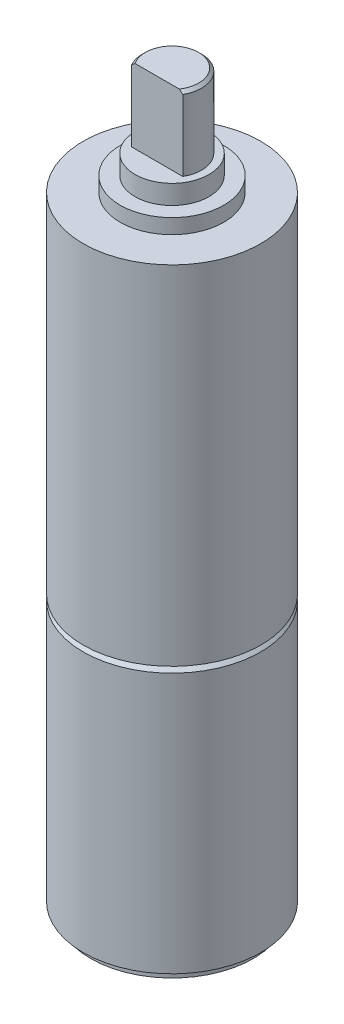
ISO-10303-21;
HEADER;
FILE_DESCRIPTION(('STEP AP214'),'2;1');
FILE_NAME('part.step','',(''),(''),'','','');
FILE_SCHEMA(('AUTOMOTIVE_DESIGN { 1 0 10303 214 1 1 1 1 }'));
ENDSEC;
DATA;
#1=APPLICATION_CONTEXT('core data for automotive mechanical design processes');
#2=APPLICATION_PROTOCOL_DEFINITION('international standard','automotive_design',2000,#1);
#3=PRODUCT_CONTEXT('',#1,'mechanical');
#4=PRODUCT('Part','Part','',(#3));
#5=PRODUCT_RELATED_PRODUCT_CATEGORY('part','',(#4));
#6=PRODUCT_DEFINITION_FORMATION('','',#4);
#7=PRODUCT_DEFINITION_CONTEXT('part definition',#1,'design');
#8=PRODUCT_DEFINITION('design','',#6,#7);
#9=PRODUCT_DEFINITION_SHAPE('','',#8);
#10=(LENGTH_UNIT() NAMED_UNIT(*) SI_UNIT(.MILLI.,.METRE.));
#11=(NAMED_UNIT(*) PLANE_ANGLE_UNIT() SI_UNIT($,.RADIAN.));
#12=(NAMED_UNIT(*) SI_UNIT($,.STERADIAN.) SOLID_ANGLE_UNIT());
#13=UNCERTAINTY_MEASURE_WITH_UNIT(LENGTH_MEASURE(1.E-05),#10,'distance_accuracy_value','');
#14=(GEOMETRIC_REPRESENTATION_CONTEXT(3) GLOBAL_UNCERTAINTY_ASSIGNED_CONTEXT((#13)) GLOBAL_UNIT_ASSIGNED_CONTEXT((#10,
#11,#12)) REPRESENTATION_CONTEXT('',''));
#15=CARTESIAN_POINT('',(0.,0.,0.));
#16=DIRECTION('',(0.,0.,1.));
#17=DIRECTION('',(1.,0.,0.));
#18=AXIS2_PLACEMENT_3D('',#15,#16,#17);
#19=CARTESIAN_POINT('',(0.,24.7,0.));
#20=DIRECTION('',(0.,-1.,0.));
#21=DIRECTION('',(0.,0.,-1.));
#22=AXIS2_PLACEMENT_3D('',#19,#20,#21);
#23=CYLINDRICAL_SURFACE('',#22,1.);
#24=DIRECTION('',(0.,1.,0.));
#25=VECTOR('',#24,1.);
#26=CARTESIAN_POINT('',(-0.866025403784439,22.2,0.5));
#27=LINE('',#26,#25);
#28=CARTESIAN_POINT('',(-0.866025403784439,22.2,0.5));
#29=VERTEX_POINT('',#28);
#30=CARTESIAN_POINT('',(-0.866025403784439,24.6,0.5));
#31=VERTEX_POINT('',#30);
#32=EDGE_CURVE('E84',#29,#31,#27,.T.);
#33=ORIENTED_EDGE('',*,*,#32,.T.);
#34=CARTESIAN_POINT('',(0.,24.6,0.));
#35=DIRECTION('',(0.,1.,0.));
#36=DIRECTION('',(0.,0.,1.));
#37=AXIS2_PLACEMENT_3D('',#34,#35,#36);
#38=CIRCLE('',#37,1.);
#39=CARTESIAN_POINT('',(0.866025403784438,24.6,0.5));
#40=VERTEX_POINT('',#39);
#41=EDGE_CURVE('E11',#31,#40,#38,.F.);
#42=ORIENTED_EDGE('',*,*,#41,.T.);
#43=DIRECTION('',(0.,1.,0.));
#44=VECTOR('',#43,1.);
#45=CARTESIAN_POINT('',(0.866025403784438,22.2,0.5));
#46=LINE('',#45,#44);
#47=CARTESIAN_POINT('',(0.866025403784438,22.2,0.5));
#48=VERTEX_POINT('',#47);
#49=EDGE_CURVE('E82',#48,#40,#46,.T.);
#50=ORIENTED_EDGE('',*,*,#49,.F.);
#51=CARTESIAN_POINT('',(0.,22.2,0.));
#52=DIRECTION('',(0.,1.,0.));
#53=DIRECTION('',(0.,0.,1.));
#54=AXIS2_PLACEMENT_3D('',#51,#52,#53);
#55=CIRCLE('',#54,1.);
#56=EDGE_CURVE('E90',#29,#48,#55,.F.);
#57=ORIENTED_EDGE('',*,*,#56,.F.);
#58=EDGE_LOOP('',(#33,#42,#50,#57));
#59=FACE_BOUND('',#58,.T.);
#60=ADVANCED_FACE('F47',(#59),#23,.T.);
#61=CARTESIAN_POINT('',(0.,24.7,0.));
#62=DIRECTION('',(0.,1.,0.));
#63=DIRECTION('',(0.,0.,1.));
#64=AXIS2_PLACEMENT_3D('',#61,#62,#63);
#65=PLANE('',#64);
#66=DIRECTION('',(1.,0.,0.));
#67=VECTOR('',#66,1.);
#68=CARTESIAN_POINT('',(0.,24.7,0.5));
#69=LINE('',#68,#67);
#70=CARTESIAN_POINT('',(-0.74833147735479,24.7,0.5));
#71=VERTEX_POINT('',#70);
#72=CARTESIAN_POINT('',(0.74833147735479,24.7,0.5));
#73=VERTEX_POINT('',#72);
#74=EDGE_CURVE('E88',#71,#73,#69,.T.);
#75=ORIENTED_EDGE('',*,*,#74,.T.);
#76=CARTESIAN_POINT('',(0.,24.7,0.));
#77=DIRECTION('',(0.,1.,0.));
#78=DIRECTION('',(0.,0.,1.));
#79=AXIS2_PLACEMENT_3D('',#76,#77,#78);
#80=CIRCLE('',#79,0.900000000000001);
#81=EDGE_CURVE('E103',#73,#71,#80,.T.);
#82=ORIENTED_EDGE('',*,*,#81,.T.);
#83=EDGE_LOOP('',(#75,#82));
#84=FACE_BOUND('',#83,.T.);
#85=ADVANCED_FACE('F120',(#84),#65,.T.);
#86=CARTESIAN_POINT('',(0.,0.3,0.));
#87=DIRECTION('',(0.,-1.,0.));
#88=DIRECTION('',(0.,0.,-1.));
#89=AXIS2_PLACEMENT_3D('',#86,#87,#88);
#90=CYLINDRICAL_SURFACE('',#89,2.75);
#91=CARTESIAN_POINT('',(0.,0.3,0.));
#92=DIRECTION('',(0.,1.,0.));
#93=DIRECTION('',(0.,0.,1.));
#94=AXIS2_PLACEMENT_3D('',#91,#92,#93);
#95=CIRCLE('',#94,2.75);
#96=CARTESIAN_POINT('',(0.,0.3,2.75));
#97=VERTEX_POINT('',#96);
#98=EDGE_CURVE('E184',#97,#97,#95,.T.);
#99=ORIENTED_EDGE('',*,*,#98,.F.);
#100=EDGE_LOOP('',(#99));
#101=FACE_BOUND('',#100,.T.);
#102=CARTESIAN_POINT('',(0.,0.,0.));
#103=DIRECTION('',(0.,1.,0.));
#104=DIRECTION('',(0.,0.,1.));
#105=AXIS2_PLACEMENT_3D('',#102,#103,#104);
#106=CIRCLE('',#105,2.75);
#107=CARTESIAN_POINT('',(0.,0.,2.75));
#108=VERTEX_POINT('',#107);
#109=EDGE_CURVE('E187',#108,#108,#106,.T.);
#110=ORIENTED_EDGE('',*,*,#109,.T.);
#111=EDGE_LOOP('',(#110));
#112=FACE_BOUND('',#111,.T.);
#113=ADVANCED_FACE('F124',(#101,#112),#90,.T.);
#114=CARTESIAN_POINT('',(0.,0.,0.));
#115=DIRECTION('',(0.,1.,0.));
#116=DIRECTION('',(0.,0.,1.));
#117=AXIS2_PLACEMENT_3D('',#114,#115,#116);
#118=PLANE('',#117);
#119=ORIENTED_EDGE('',*,*,#109,.F.);
#120=EDGE_LOOP('',(#119));
#121=FACE_BOUND('',#120,.T.);
#122=ADVANCED_FACE('F162',(#121),#118,.F.);
#123=CARTESIAN_POINT('',(0.,9.3,0.));
#124=DIRECTION('',(0.,-1.,0.));
#125=DIRECTION('',(0.,0.,-1.));
#126=AXIS2_PLACEMENT_3D('',#123,#124,#125);
#127=CYLINDRICAL_SURFACE('',#126,3.);
#128=CARTESIAN_POINT('',(0.,9.1,0.));
#129=DIRECTION('',(0.,1.,0.));
#130=DIRECTION('',(0.,0.,1.));
#131=AXIS2_PLACEMENT_3D('',#128,#129,#130);
#132=CIRCLE('',#131,3.);
#133=CARTESIAN_POINT('',(0.,9.1,3.));
#134=VERTEX_POINT('',#133);
#135=EDGE_CURVE('E180',#134,#134,#132,.F.);
#136=ORIENTED_EDGE('',*,*,#135,.T.);
#137=EDGE_LOOP('',(#136));
#138=FACE_BOUND('',#137,.T.);
#139=CARTESIAN_POINT('',(0.,0.3,0.));
#140=DIRECTION('',(0.,1.,0.));
#141=DIRECTION('',(0.,0.,1.));
#142=AXIS2_PLACEMENT_3D('',#139,#140,#141);
#143=CIRCLE('',#142,3.);
#144=CARTESIAN_POINT('',(0.,0.3,3.));
#145=VERTEX_POINT('',#144);
#146=EDGE_CURVE('E191',#145,#145,#143,.T.);
#147=ORIENTED_EDGE('',*,*,#146,.T.);
#148=EDGE_LOOP('',(#147));
#149=FACE_BOUND('',#148,.T.);
#150=ADVANCED_FACE('F158',(#138,#149),#127,.T.);
#151=CARTESIAN_POINT('',(0.,0.3,0.));
#152=DIRECTION('',(0.,1.,0.));
#153=DIRECTION('',(0.,0.,1.));
#154=AXIS2_PLACEMENT_3D('',#151,#152,#153);
#155=PLANE('',#154);
#156=ORIENTED_EDGE('',*,*,#98,.T.);
#157=EDGE_LOOP('',(#156));
#158=FACE_BOUND('',#157,.T.);
#159=ORIENTED_EDGE('',*,*,#146,.F.);
#160=EDGE_LOOP('',(#159));
#161=FACE_BOUND('',#160,.T.);
#162=ADVANCED_FACE('F155',(#158,#161),#155,.F.);
#163=CARTESIAN_POINT('',(0.,9.3,0.));
#164=DIRECTION('',(0.,-1.,0.));
#165=DIRECTION('',(0.,0.,-1.));
#166=AXIS2_PLACEMENT_3D('',#163,#164,#165);
#167=CONICAL_SURFACE('',#166,2.8,0.785398163397444);
#168=ORIENTED_EDGE('',*,*,#135,.F.);
#169=EDGE_LOOP('',(#168));
#170=FACE_BOUND('',#169,.T.);
#171=CARTESIAN_POINT('',(0.,9.3,0.));
#172=DIRECTION('',(0.,1.,0.));
#173=DIRECTION('',(0.,0.,1.));
#174=AXIS2_PLACEMENT_3D('',#171,#172,#173);
#175=CIRCLE('',#174,2.8);
#176=CARTESIAN_POINT('',(0.,9.3,2.8));
#177=VERTEX_POINT('',#176);
#178=EDGE_CURVE('E183',#177,#177,#175,.T.);
#179=ORIENTED_EDGE('',*,*,#178,.F.);
#180=EDGE_LOOP('',(#179));
#181=FACE_BOUND('',#180,.T.);
#182=ADVANCED_FACE('F153',(#170,#181),#167,.T.);
#183=CARTESIAN_POINT('',(0.,21.05,0.));
#184=DIRECTION('',(0.,-1.,0.));
#185=DIRECTION('',(0.,0.,-1.));
#186=AXIS2_PLACEMENT_3D('',#183,#184,#185);
#187=CYLINDRICAL_SURFACE('',#186,3.);
#188=CARTESIAN_POINT('',(0.,21.05,0.));
#189=DIRECTION('',(0.,1.,0.));
#190=DIRECTION('',(0.,0.,1.));
#191=AXIS2_PLACEMENT_3D('',#188,#189,#190);
#192=CIRCLE('',#191,3.);
#193=CARTESIAN_POINT('',(0.,21.05,3.));
#194=VERTEX_POINT('',#193);
#195=EDGE_CURVE('E195',#194,#194,#192,.T.);
#196=ORIENTED_EDGE('',*,*,#195,.F.);
#197=EDGE_LOOP('',(#196));
#198=FACE_BOUND('',#197,.T.);
#199=CARTESIAN_POINT('',(0.,9.3,0.));
#200=DIRECTION('',(0.,1.,0.));
#201=DIRECTION('',(0.,0.,1.));
#202=AXIS2_PLACEMENT_3D('',#199,#200,#201);
#203=CIRCLE('',#202,3.);
#204=CARTESIAN_POINT('',(0.,9.3,3.));
#205=VERTEX_POINT('',#204);
#206=EDGE_CURVE('E196',#205,#205,#203,.T.);
#207=ORIENTED_EDGE('',*,*,#206,.T.);
#208=EDGE_LOOP('',(#207));
#209=FACE_BOUND('',#208,.T.);
#210=ADVANCED_FACE('F146',(#198,#209),#187,.T.);
#211=CARTESIAN_POINT('',(0.,21.05,0.));
#212=DIRECTION('',(0.,1.,0.));
#213=DIRECTION('',(0.,0.,1.));
#214=AXIS2_PLACEMENT_3D('',#211,#212,#213);
#215=PLANE('',#214);
#216=CARTESIAN_POINT('',(0.,21.05,0.));
#217=DIRECTION('',(0.,1.,0.));
#218=DIRECTION('',(0.,0.,1.));
#219=AXIS2_PLACEMENT_3D('',#216,#217,#218);
#220=CIRCLE('',#219,1.75);
#221=CARTESIAN_POINT('',(0.,21.05,1.75));
#222=VERTEX_POINT('',#221);
#223=EDGE_CURVE('E107',#222,#222,#220,.T.);
#224=ORIENTED_EDGE('',*,*,#223,.F.);
#225=EDGE_LOOP('',(#224));
#226=FACE_BOUND('',#225,.T.);
#227=ORIENTED_EDGE('',*,*,#195,.T.);
#228=EDGE_LOOP('',(#227));
#229=FACE_BOUND('',#228,.T.);
#230=ADVANCED_FACE('F143',(#226,#229),#215,.T.);
#231=CARTESIAN_POINT('',(0.,9.3,0.));
#232=DIRECTION('',(0.,1.,0.));
#233=DIRECTION('',(0.,0.,1.));
#234=AXIS2_PLACEMENT_3D('',#231,#232,#233);
#235=PLANE('',#234);
#236=ORIENTED_EDGE('',*,*,#178,.T.);
#237=EDGE_LOOP('',(#236));
#238=FACE_BOUND('',#237,.T.);
#239=ORIENTED_EDGE('',*,*,#206,.F.);
#240=EDGE_LOOP('',(#239));
#241=FACE_BOUND('',#240,.T.);
#242=ADVANCED_FACE('F141',(#238,#241),#235,.F.);
#243=CARTESIAN_POINT('',(0.,21.55,0.));
#244=DIRECTION('',(0.,-1.,0.));
#245=DIRECTION('',(0.,0.,-1.));
#246=AXIS2_PLACEMENT_3D('',#243,#244,#245);
#247=CYLINDRICAL_SURFACE('',#246,1.75);
#248=CARTESIAN_POINT('',(0.,21.55,0.));
#249=DIRECTION('',(0.,1.,0.));
#250=DIRECTION('',(0.,0.,1.));
#251=AXIS2_PLACEMENT_3D('',#248,#249,#250);
#252=CIRCLE('',#251,1.75);
#253=CARTESIAN_POINT('',(0.,21.55,1.75));
#254=VERTEX_POINT('',#253);
#255=EDGE_CURVE('E199',#254,#254,#252,.T.);
#256=ORIENTED_EDGE('',*,*,#255,.F.);
#257=EDGE_LOOP('',(#256));
#258=FACE_BOUND('',#257,.T.);
#259=ORIENTED_EDGE('',*,*,#223,.T.);
#260=EDGE_LOOP('',(#259));
#261=FACE_BOUND('',#260,.T.);
#262=ADVANCED_FACE('F137',(#258,#261),#247,.T.);
#263=CARTESIAN_POINT('',(0.,21.55,0.));
#264=DIRECTION('',(0.,1.,0.));
#265=DIRECTION('',(0.,0.,1.));
#266=AXIS2_PLACEMENT_3D('',#263,#264,#265);
#267=PLANE('',#266);
#268=CARTESIAN_POINT('',(0.,21.55,0.));
#269=DIRECTION('',(0.,1.,0.));
#270=DIRECTION('',(0.,0.,1.));
#271=AXIS2_PLACEMENT_3D('',#268,#269,#270);
#272=CIRCLE('',#271,1.25);
#273=CARTESIAN_POINT('',(0.,21.55,1.25));
#274=VERTEX_POINT('',#273);
#275=EDGE_CURVE('E97',#274,#274,#272,.F.);
#276=ORIENTED_EDGE('',*,*,#275,.T.);
#277=EDGE_LOOP('',(#276));
#278=FACE_BOUND('',#277,.T.);
#279=ORIENTED_EDGE('',*,*,#255,.T.);
#280=EDGE_LOOP('',(#279));
#281=FACE_BOUND('',#280,.T.);
#282=ADVANCED_FACE('F133',(#278,#281),#267,.T.);
#283=CARTESIAN_POINT('',(0.,22.2,0.));
#284=DIRECTION('',(0.,-1.,0.));
#285=DIRECTION('',(0.,0.,-1.));
#286=AXIS2_PLACEMENT_3D('',#283,#284,#285);
#287=CYLINDRICAL_SURFACE('',#286,1.25);
#288=ORIENTED_EDGE('',*,*,#275,.F.);
#289=EDGE_LOOP('',(#288));
#290=FACE_BOUND('',#289,.T.);
#291=CARTESIAN_POINT('',(0.,22.2,0.));
#292=DIRECTION('',(0.,1.,0.));
#293=DIRECTION('',(0.,0.,1.));
#294=AXIS2_PLACEMENT_3D('',#291,#292,#293);
#295=CIRCLE('',#294,1.25);
#296=CARTESIAN_POINT('',(0.,22.2,1.25));
#297=VERTEX_POINT('',#296);
#298=EDGE_CURVE('E94',#297,#297,#295,.T.);
#299=ORIENTED_EDGE('',*,*,#298,.F.);
#300=EDGE_LOOP('',(#299));
#301=FACE_BOUND('',#300,.T.);
#302=ADVANCED_FACE('F130',(#290,#301),#287,.T.);
#303=CARTESIAN_POINT('',(0.,22.2,0.));
#304=DIRECTION('',(0.,1.,0.));
#305=DIRECTION('',(0.,0.,1.));
#306=AXIS2_PLACEMENT_3D('',#303,#304,#305);
#307=PLANE('',#306);
#308=ORIENTED_EDGE('',*,*,#56,.T.);
#309=DIRECTION('',(1.,0.,0.));
#310=VECTOR('',#309,1.);
#311=CARTESIAN_POINT('',(0.,22.2,0.5));
#312=LINE('',#311,#310);
#313=EDGE_CURVE('E80',#29,#48,#312,.T.);
#314=ORIENTED_EDGE('',*,*,#313,.F.);
#315=EDGE_LOOP('',(#308,#314));
#316=FACE_BOUND('',#315,.T.);
#317=ORIENTED_EDGE('',*,*,#298,.T.);
#318=EDGE_LOOP('',(#317));
#319=FACE_BOUND('',#318,.T.);
#320=ADVANCED_FACE('F92',(#316,#319),#307,.T.);
#321=CARTESIAN_POINT('',(0.,22.2,0.5));
#322=DIRECTION('',(0.,0.,1.));
#323=DIRECTION('',(1.,0.,0.));
#324=AXIS2_PLACEMENT_3D('',#321,#322,#323);
#325=PLANE('',#324);
#326=ORIENTED_EDGE('',*,*,#74,.F.);
#327=CARTESIAN_POINT('',(-0.74833147735479,24.7,0.5));
#328=CARTESIAN_POINT('',(-0.768113885732057,24.6835295402556,0.5));
#329=CARTESIAN_POINT('',(-0.787812929934623,24.6669609659421,0.5));
#330=CARTESIAN_POINT('',(-0.827044238305195,24.6336276320917,0.5));
#331=CARTESIAN_POINT('',(-0.846576502912512,24.6168628730719,0.5));
#332=CARTESIAN_POINT('',(-0.866025403784438,24.6,0.5));
#333=B_SPLINE_CURVE_WITH_KNOTS('',3,(#327,#328,#329,#330,#331,#332),.UNSPECIFIED.,.F.,.F.,(4,2,
4),(0.,0.077221305191577,0.154442406913507),.UNSPECIFIED.);
#334=EDGE_CURVE('E57',#71,#31,#333,.T.);
#335=ORIENTED_EDGE('',*,*,#334,.T.);
#336=ORIENTED_EDGE('',*,*,#32,.F.);
#337=ORIENTED_EDGE('',*,*,#313,.T.);
#338=ORIENTED_EDGE('',*,*,#49,.T.);
#339=CARTESIAN_POINT('',(0.866025403784439,24.6,0.5));
#340=CARTESIAN_POINT('',(0.846576502912513,24.6168628730719,0.5));
#341=CARTESIAN_POINT('',(0.827044238305197,24.6336276320917,0.5));
#342=CARTESIAN_POINT('',(0.787812929934625,24.6669609659421,0.5));
#343=CARTESIAN_POINT('',(0.768113885732058,24.6835295402556,0.5));
#344=CARTESIAN_POINT('',(0.748331477354791,24.7,0.5));
#345=B_SPLINE_CURVE_WITH_KNOTS('',3,(#339,#340,#341,#342,#343,#344),.UNSPECIFIED.,.F.,.F.,(4,2,
4),(0.,0.0772211017219292,0.154442406913507),.UNSPECIFIED.);
#346=EDGE_CURVE('E106',#40,#73,#345,.T.);
#347=ORIENTED_EDGE('',*,*,#346,.T.);
#348=EDGE_LOOP('',(#326,#335,#336,#337,#338,#347));
#349=FACE_BOUND('',#348,.T.);
#350=ADVANCED_FACE('F81',(#349),#325,.T.);
#351=CARTESIAN_POINT('',(0.,24.7,0.));
#352=DIRECTION('',(0.,-1.,0.));
#353=DIRECTION('',(0.,0.,-1.));
#354=AXIS2_PLACEMENT_3D('',#351,#352,#353);
#355=CONICAL_SURFACE('',#354,0.900000000000001,0.785398163397444);
#356=ORIENTED_EDGE('',*,*,#346,.F.);
#357=ORIENTED_EDGE('',*,*,#41,.F.);
#358=ORIENTED_EDGE('',*,*,#334,.F.);
#359=ORIENTED_EDGE('',*,*,#81,.F.);
#360=EDGE_LOOP('',(#356,#357,#358,#359));
#361=FACE_BOUND('',#360,.T.);
#362=ADVANCED_FACE('F50',(#361),#355,.T.);
#363=CLOSED_SHELL('',(#60,#85,#113,#122,#150,#162,#182,#210,#230,#242,#262,#282,#302,#320,#350,#362));
#364=MANIFOLD_SOLID_BREP('B2',#363);
#365=ADVANCED_BREP_SHAPE_REPRESENTATION('',(#18,#364),#14);
#366=SHAPE_DEFINITION_REPRESENTATION(#9,#365);
ENDSEC;
END-ISO-10303-21;
